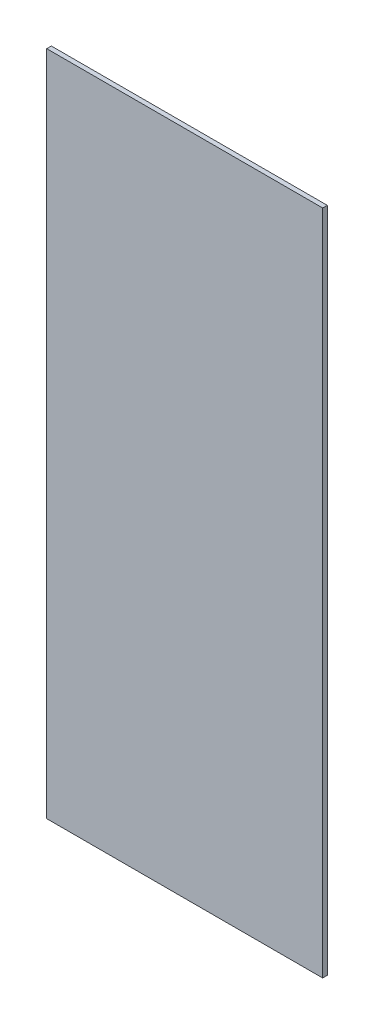
ISO-10303-21;
HEADER;
FILE_DESCRIPTION(('STEP AP214'),'2;1');
FILE_NAME('part.step','',(''),(''),'','','');
FILE_SCHEMA(('AUTOMOTIVE_DESIGN { 1 0 10303 214 1 1 1 1 }'));
ENDSEC;
DATA;
#1=APPLICATION_CONTEXT('core data for automotive mechanical design processes');
#2=APPLICATION_PROTOCOL_DEFINITION('international standard','automotive_design',2000,#1);
#3=PRODUCT_CONTEXT('',#1,'mechanical');
#4=PRODUCT('Part','Part','',(#3));
#5=PRODUCT_RELATED_PRODUCT_CATEGORY('part','',(#4));
#6=PRODUCT_DEFINITION_FORMATION('','',#4);
#7=PRODUCT_DEFINITION_CONTEXT('part definition',#1,'design');
#8=PRODUCT_DEFINITION('design','',#6,#7);
#9=PRODUCT_DEFINITION_SHAPE('','',#8);
#10=(LENGTH_UNIT() NAMED_UNIT(*) SI_UNIT(.MILLI.,.METRE.));
#11=(NAMED_UNIT(*) PLANE_ANGLE_UNIT() SI_UNIT($,.RADIAN.));
#12=(NAMED_UNIT(*) SI_UNIT($,.STERADIAN.) SOLID_ANGLE_UNIT());
#13=UNCERTAINTY_MEASURE_WITH_UNIT(LENGTH_MEASURE(1.E-05),#10,'distance_accuracy_value','');
#14=(GEOMETRIC_REPRESENTATION_CONTEXT(3) GLOBAL_UNCERTAINTY_ASSIGNED_CONTEXT((#13)) GLOBAL_UNIT_ASSIGNED_CONTEXT((#10,
#11,#12)) REPRESENTATION_CONTEXT('',''));
#15=CARTESIAN_POINT('',(0.,0.,0.));
#16=DIRECTION('',(0.,0.,1.));
#17=DIRECTION('',(1.,0.,0.));
#18=AXIS2_PLACEMENT_3D('',#15,#16,#17);
#19=CARTESIAN_POINT('',(60.,145.,2.));
#20=DIRECTION('',(-1.,0.,0.));
#21=DIRECTION('',(0.,-1.,0.));
#22=AXIS2_PLACEMENT_3D('',#19,#20,#21);
#23=PLANE('',#22);
#24=DIRECTION('',(0.,1.,0.));
#25=VECTOR('',#24,1.);
#26=CARTESIAN_POINT('',(60.,145.,0.));
#27=LINE('',#26,#25);
#28=CARTESIAN_POINT('',(60.,-145.,0.));
#29=VERTEX_POINT('',#28);
#30=CARTESIAN_POINT('',(60.,145.,0.));
#31=VERTEX_POINT('',#30);
#32=EDGE_CURVE('E98',#29,#31,#27,.T.);
#33=ORIENTED_EDGE('',*,*,#32,.T.);
#34=DIRECTION('',(0.,0.,-1.));
#35=VECTOR('',#34,1.);
#36=CARTESIAN_POINT('',(60.,145.,2.));
#37=LINE('',#36,#35);
#38=CARTESIAN_POINT('',(60.,145.,2.));
#39=VERTEX_POINT('',#38);
#40=EDGE_CURVE('E11',#39,#31,#37,.T.);
#41=ORIENTED_EDGE('',*,*,#40,.F.);
#42=DIRECTION('',(0.,1.,0.));
#43=VECTOR('',#42,1.);
#44=CARTESIAN_POINT('',(60.,145.,2.));
#45=LINE('',#44,#43);
#46=CARTESIAN_POINT('',(60.,-145.,2.));
#47=VERTEX_POINT('',#46);
#48=EDGE_CURVE('E86',#47,#39,#45,.T.);
#49=ORIENTED_EDGE('',*,*,#48,.F.);
#50=DIRECTION('',(0.,0.,-1.));
#51=VECTOR('',#50,1.);
#52=CARTESIAN_POINT('',(60.,-145.,2.));
#53=LINE('',#52,#51);
#54=EDGE_CURVE('E94',#47,#29,#53,.T.);
#55=ORIENTED_EDGE('',*,*,#54,.T.);
#56=EDGE_LOOP('',(#33,#41,#49,#55));
#57=FACE_BOUND('',#56,.T.);
#58=ADVANCED_FACE('F35',(#57),#23,.F.);
#59=CARTESIAN_POINT('',(-60.,145.,2.));
#60=DIRECTION('',(0.,-1.,0.));
#61=DIRECTION('',(0.,0.,-1.));
#62=AXIS2_PLACEMENT_3D('',#59,#60,#61);
#63=PLANE('',#62);
#64=DIRECTION('',(-1.,0.,0.));
#65=VECTOR('',#64,1.);
#66=CARTESIAN_POINT('',(-60.,145.,0.));
#67=LINE('',#66,#65);
#68=CARTESIAN_POINT('',(-60.,145.,0.));
#69=VERTEX_POINT('',#68);
#70=EDGE_CURVE('E90',#31,#69,#67,.T.);
#71=ORIENTED_EDGE('',*,*,#70,.T.);
#72=DIRECTION('',(0.,0.,-1.));
#73=VECTOR('',#72,1.);
#74=CARTESIAN_POINT('',(-60.,145.,2.));
#75=LINE('',#74,#73);
#76=CARTESIAN_POINT('',(-60.,145.,2.));
#77=VERTEX_POINT('',#76);
#78=EDGE_CURVE('E43',#77,#69,#75,.T.);
#79=ORIENTED_EDGE('',*,*,#78,.F.);
#80=DIRECTION('',(-1.,0.,0.));
#81=VECTOR('',#80,1.);
#82=CARTESIAN_POINT('',(-60.,145.,2.));
#83=LINE('',#82,#81);
#84=EDGE_CURVE('E81',#39,#77,#83,.T.);
#85=ORIENTED_EDGE('',*,*,#84,.F.);
#86=ORIENTED_EDGE('',*,*,#40,.T.);
#87=EDGE_LOOP('',(#71,#79,#85,#86));
#88=FACE_BOUND('',#87,.T.);
#89=ADVANCED_FACE('F89',(#88),#63,.F.);
#90=CARTESIAN_POINT('',(-60.,145.,2.));
#91=DIRECTION('',(1.,0.,0.));
#92=DIRECTION('',(0.,1.,0.));
#93=AXIS2_PLACEMENT_3D('',#90,#91,#92);
#94=PLANE('',#93);
#95=DIRECTION('',(0.,-1.,0.));
#96=VECTOR('',#95,1.);
#97=CARTESIAN_POINT('',(-60.,145.,0.));
#98=LINE('',#97,#96);
#99=CARTESIAN_POINT('',(-60.,-145.,0.));
#100=VERTEX_POINT('',#99);
#101=EDGE_CURVE('E68',#69,#100,#98,.T.);
#102=ORIENTED_EDGE('',*,*,#101,.T.);
#103=DIRECTION('',(0.,0.,-1.));
#104=VECTOR('',#103,1.);
#105=CARTESIAN_POINT('',(-60.,-145.,2.));
#106=LINE('',#105,#104);
#107=CARTESIAN_POINT('',(-60.,-145.,2.));
#108=VERTEX_POINT('',#107);
#109=EDGE_CURVE('E91',#108,#100,#106,.T.);
#110=ORIENTED_EDGE('',*,*,#109,.F.);
#111=DIRECTION('',(0.,-1.,0.));
#112=VECTOR('',#111,1.);
#113=CARTESIAN_POINT('',(-60.,145.,2.));
#114=LINE('',#113,#112);
#115=EDGE_CURVE('E84',#77,#108,#114,.T.);
#116=ORIENTED_EDGE('',*,*,#115,.F.);
#117=ORIENTED_EDGE('',*,*,#78,.T.);
#118=EDGE_LOOP('',(#102,#110,#116,#117));
#119=FACE_BOUND('',#118,.T.);
#120=ADVANCED_FACE('F92',(#119),#94,.F.);
#121=CARTESIAN_POINT('',(-60.,-145.,2.));
#122=DIRECTION('',(0.,1.,0.));
#123=DIRECTION('',(0.,0.,1.));
#124=AXIS2_PLACEMENT_3D('',#121,#122,#123);
#125=PLANE('',#124);
#126=DIRECTION('',(1.,0.,0.));
#127=VECTOR('',#126,1.);
#128=CARTESIAN_POINT('',(-60.,-145.,0.));
#129=LINE('',#128,#127);
#130=EDGE_CURVE('E74',#100,#29,#129,.T.);
#131=ORIENTED_EDGE('',*,*,#130,.T.);
#132=ORIENTED_EDGE('',*,*,#54,.F.);
#133=DIRECTION('',(1.,0.,0.));
#134=VECTOR('',#133,1.);
#135=CARTESIAN_POINT('',(-60.,-145.,2.));
#136=LINE('',#135,#134);
#137=EDGE_CURVE('E51',#108,#47,#136,.T.);
#138=ORIENTED_EDGE('',*,*,#137,.F.);
#139=ORIENTED_EDGE('',*,*,#109,.T.);
#140=EDGE_LOOP('',(#131,#132,#138,#139));
#141=FACE_BOUND('',#140,.T.);
#142=ADVANCED_FACE('F105',(#141),#125,.F.);
#143=CARTESIAN_POINT('',(0.,0.,2.));
#144=DIRECTION('',(0.,0.,1.));
#145=DIRECTION('',(1.,0.,0.));
#146=AXIS2_PLACEMENT_3D('',#143,#144,#145);
#147=PLANE('',#146);
#148=ORIENTED_EDGE('',*,*,#48,.T.);
#149=ORIENTED_EDGE('',*,*,#84,.T.);
#150=ORIENTED_EDGE('',*,*,#115,.T.);
#151=ORIENTED_EDGE('',*,*,#137,.T.);
#152=EDGE_LOOP('',(#148,#149,#150,#151));
#153=FACE_BOUND('',#152,.T.);
#154=ADVANCED_FACE('F82',(#153),#147,.T.);
#155=CARTESIAN_POINT('',(0.,0.,0.));
#156=DIRECTION('',(0.,0.,1.));
#157=DIRECTION('',(1.,0.,0.));
#158=AXIS2_PLACEMENT_3D('',#155,#156,#157);
#159=PLANE('',#158);
#160=ORIENTED_EDGE('',*,*,#32,.F.);
#161=ORIENTED_EDGE('',*,*,#130,.F.);
#162=ORIENTED_EDGE('',*,*,#101,.F.);
#163=ORIENTED_EDGE('',*,*,#70,.F.);
#164=EDGE_LOOP('',(#160,#161,#162,#163));
#165=FACE_BOUND('',#164,.T.);
#166=ADVANCED_FACE('F108',(#165),#159,.F.);
#167=CLOSED_SHELL('',(#58,#89,#120,#142,#154,#166));
#168=MANIFOLD_SOLID_BREP('B2',#167);
#169=ADVANCED_BREP_SHAPE_REPRESENTATION('',(#18,#168),#14);
#170=SHAPE_DEFINITION_REPRESENTATION(#9,#169);
ENDSEC;
END-ISO-10303-21;
